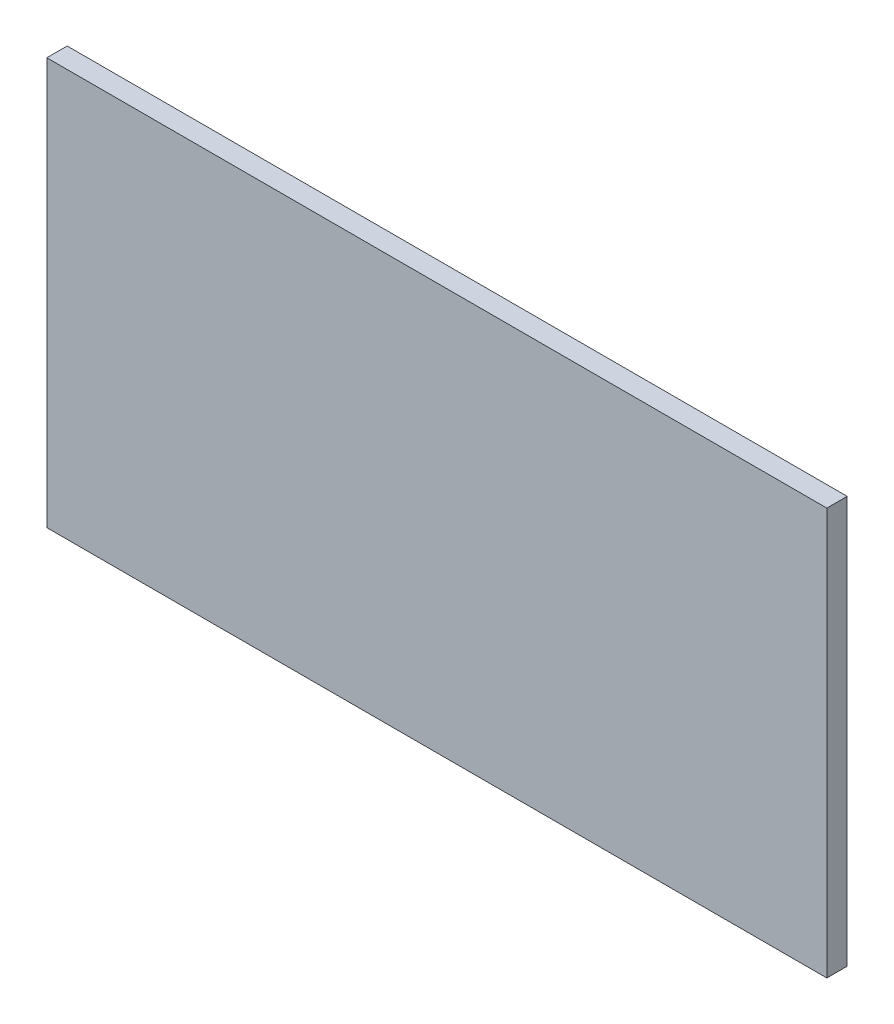
ISO-10303-21;
HEADER;
FILE_DESCRIPTION(('STEP AP214'),'2;1');
FILE_NAME('part.step','',(''),(''),'','','');
FILE_SCHEMA(('AUTOMOTIVE_DESIGN { 1 0 10303 214 1 1 1 1 }'));
ENDSEC;
DATA;
#1=APPLICATION_CONTEXT('core data for automotive mechanical design processes');
#2=APPLICATION_PROTOCOL_DEFINITION('international standard','automotive_design',2000,#1);
#3=PRODUCT_CONTEXT('',#1,'mechanical');
#4=PRODUCT('Part','Part','',(#3));
#5=PRODUCT_RELATED_PRODUCT_CATEGORY('part','',(#4));
#6=PRODUCT_DEFINITION_FORMATION('','',#4);
#7=PRODUCT_DEFINITION_CONTEXT('part definition',#1,'design');
#8=PRODUCT_DEFINITION('design','',#6,#7);
#9=PRODUCT_DEFINITION_SHAPE('','',#8);
#10=(LENGTH_UNIT() NAMED_UNIT(*) SI_UNIT(.MILLI.,.METRE.));
#11=(NAMED_UNIT(*) PLANE_ANGLE_UNIT() SI_UNIT($,.RADIAN.));
#12=(NAMED_UNIT(*) SI_UNIT($,.STERADIAN.) SOLID_ANGLE_UNIT());
#13=UNCERTAINTY_MEASURE_WITH_UNIT(LENGTH_MEASURE(1.E-05),#10,'distance_accuracy_value','');
#14=(GEOMETRIC_REPRESENTATION_CONTEXT(3) GLOBAL_UNCERTAINTY_ASSIGNED_CONTEXT((#13)) GLOBAL_UNIT_ASSIGNED_CONTEXT((#10,
#11,#12)) REPRESENTATION_CONTEXT('',''));
#15=CARTESIAN_POINT('',(0.,0.,0.));
#16=DIRECTION('',(0.,0.,1.));
#17=DIRECTION('',(1.,0.,0.));
#18=AXIS2_PLACEMENT_3D('',#15,#16,#17);
#19=CARTESIAN_POINT('',(0.,0.,6.));
#20=DIRECTION('',(1.,0.,0.));
#21=DIRECTION('',(0.,1.,0.));
#22=AXIS2_PLACEMENT_3D('',#19,#20,#21);
#23=PLANE('',#22);
#24=DIRECTION('',(0.,-1.,0.));
#25=VECTOR('',#24,1.);
#26=CARTESIAN_POINT('',(0.,0.,0.));
#27=LINE('',#26,#25);
#28=CARTESIAN_POINT('',(0.,0.,0.));
#29=VERTEX_POINT('',#28);
#30=CARTESIAN_POINT('',(0.,-120.,0.));
#31=VERTEX_POINT('',#30);
#32=EDGE_CURVE('E113',#29,#31,#27,.T.);
#33=ORIENTED_EDGE('',*,*,#32,.T.);
#34=DIRECTION('',(0.,0.,-1.));
#35=VECTOR('',#34,1.);
#36=CARTESIAN_POINT('',(0.,-120.,6.));
#37=LINE('',#36,#35);
#38=CARTESIAN_POINT('',(0.,-120.,6.));
#39=VERTEX_POINT('',#38);
#40=EDGE_CURVE('E11',#39,#31,#37,.T.);
#41=ORIENTED_EDGE('',*,*,#40,.F.);
#42=DIRECTION('',(0.,-1.,0.));
#43=VECTOR('',#42,1.);
#44=CARTESIAN_POINT('',(0.,0.,6.));
#45=LINE('',#44,#43);
#46=CARTESIAN_POINT('',(0.,0.,6.));
#47=VERTEX_POINT('',#46);
#48=EDGE_CURVE('E97',#47,#39,#45,.T.);
#49=ORIENTED_EDGE('',*,*,#48,.F.);
#50=DIRECTION('',(0.,0.,-1.));
#51=VECTOR('',#50,1.);
#52=CARTESIAN_POINT('',(0.,0.,6.));
#53=LINE('',#52,#51);
#54=EDGE_CURVE('E109',#47,#29,#53,.T.);
#55=ORIENTED_EDGE('',*,*,#54,.T.);
#56=EDGE_LOOP('',(#33,#41,#49,#55));
#57=FACE_BOUND('',#56,.T.);
#58=ADVANCED_FACE('F45',(#57),#23,.F.);
#59=CARTESIAN_POINT('',(0.,-120.,6.));
#60=DIRECTION('',(0.,1.,0.));
#61=DIRECTION('',(0.,0.,1.));
#62=AXIS2_PLACEMENT_3D('',#59,#60,#61);
#63=PLANE('',#62);
#64=DIRECTION('',(1.,0.,0.));
#65=VECTOR('',#64,1.);
#66=CARTESIAN_POINT('',(0.,-120.,0.));
#67=LINE('',#66,#65);
#68=CARTESIAN_POINT('',(230.,-120.,0.));
#69=VERTEX_POINT('',#68);
#70=EDGE_CURVE('E102',#31,#69,#67,.T.);
#71=ORIENTED_EDGE('',*,*,#70,.T.);
#72=DIRECTION('',(0.,0.,-1.));
#73=VECTOR('',#72,1.);
#74=CARTESIAN_POINT('',(230.,-120.,6.));
#75=LINE('',#74,#73);
#76=CARTESIAN_POINT('',(230.,-120.,6.));
#77=VERTEX_POINT('',#76);
#78=EDGE_CURVE('E54',#77,#69,#75,.T.);
#79=ORIENTED_EDGE('',*,*,#78,.F.);
#80=DIRECTION('',(1.,0.,0.));
#81=VECTOR('',#80,1.);
#82=CARTESIAN_POINT('',(0.,-120.,6.));
#83=LINE('',#82,#81);
#84=EDGE_CURVE('E92',#39,#77,#83,.T.);
#85=ORIENTED_EDGE('',*,*,#84,.F.);
#86=ORIENTED_EDGE('',*,*,#40,.T.);
#87=EDGE_LOOP('',(#71,#79,#85,#86));
#88=FACE_BOUND('',#87,.T.);
#89=ADVANCED_FACE('F101',(#88),#63,.F.);
#90=CARTESIAN_POINT('',(230.,0.,6.));
#91=DIRECTION('',(-1.,0.,0.));
#92=DIRECTION('',(0.,-1.,0.));
#93=AXIS2_PLACEMENT_3D('',#90,#91,#92);
#94=PLANE('',#93);
#95=DIRECTION('',(0.,1.,0.));
#96=VECTOR('',#95,1.);
#97=CARTESIAN_POINT('',(230.,0.,0.));
#98=LINE('',#97,#96);
#99=CARTESIAN_POINT('',(230.,0.,0.));
#100=VERTEX_POINT('',#99);
#101=EDGE_CURVE('E79',#69,#100,#98,.T.);
#102=ORIENTED_EDGE('',*,*,#101,.T.);
#103=DIRECTION('',(0.,0.,-1.));
#104=VECTOR('',#103,1.);
#105=CARTESIAN_POINT('',(230.,0.,6.));
#106=LINE('',#105,#104);
#107=CARTESIAN_POINT('',(230.,0.,6.));
#108=VERTEX_POINT('',#107);
#109=EDGE_CURVE('E104',#108,#100,#106,.T.);
#110=ORIENTED_EDGE('',*,*,#109,.F.);
#111=DIRECTION('',(0.,1.,0.));
#112=VECTOR('',#111,1.);
#113=CARTESIAN_POINT('',(230.,0.,6.));
#114=LINE('',#113,#112);
#115=EDGE_CURVE('E95',#77,#108,#114,.T.);
#116=ORIENTED_EDGE('',*,*,#115,.F.);
#117=ORIENTED_EDGE('',*,*,#78,.T.);
#118=EDGE_LOOP('',(#102,#110,#116,#117));
#119=FACE_BOUND('',#118,.T.);
#120=ADVANCED_FACE('F105',(#119),#94,.F.);
#121=CARTESIAN_POINT('',(0.,0.,6.));
#122=DIRECTION('',(0.,-1.,0.));
#123=DIRECTION('',(0.,0.,-1.));
#124=AXIS2_PLACEMENT_3D('',#121,#122,#123);
#125=PLANE('',#124);
#126=DIRECTION('',(-1.,0.,0.));
#127=VECTOR('',#126,1.);
#128=CARTESIAN_POINT('',(0.,0.,0.));
#129=LINE('',#128,#127);
#130=EDGE_CURVE('E85',#100,#29,#129,.T.);
#131=ORIENTED_EDGE('',*,*,#130,.T.);
#132=ORIENTED_EDGE('',*,*,#54,.F.);
#133=DIRECTION('',(-1.,0.,0.));
#134=VECTOR('',#133,1.);
#135=CARTESIAN_POINT('',(0.,0.,6.));
#136=LINE('',#135,#134);
#137=EDGE_CURVE('E62',#108,#47,#136,.T.);
#138=ORIENTED_EDGE('',*,*,#137,.F.);
#139=ORIENTED_EDGE('',*,*,#109,.T.);
#140=EDGE_LOOP('',(#131,#132,#138,#139));
#141=FACE_BOUND('',#140,.T.);
#142=ADVANCED_FACE('F126',(#141),#125,.F.);
#143=CARTESIAN_POINT('',(0.,0.,6.));
#144=DIRECTION('',(0.,0.,1.));
#145=DIRECTION('',(1.,0.,0.));
#146=AXIS2_PLACEMENT_3D('',#143,#144,#145);
#147=PLANE('',#146);
#148=ORIENTED_EDGE('',*,*,#48,.T.);
#149=ORIENTED_EDGE('',*,*,#84,.T.);
#150=ORIENTED_EDGE('',*,*,#115,.T.);
#151=ORIENTED_EDGE('',*,*,#137,.T.);
#152=EDGE_LOOP('',(#148,#149,#150,#151));
#153=FACE_BOUND('',#152,.T.);
#154=ADVANCED_FACE('F93',(#153),#147,.T.);
#155=CARTESIAN_POINT('',(0.,0.,0.));
#156=DIRECTION('',(0.,0.,1.));
#157=DIRECTION('',(1.,0.,0.));
#158=AXIS2_PLACEMENT_3D('',#155,#156,#157);
#159=PLANE('',#158);
#160=ORIENTED_EDGE('',*,*,#32,.F.);
#161=ORIENTED_EDGE('',*,*,#130,.F.);
#162=ORIENTED_EDGE('',*,*,#101,.F.);
#163=ORIENTED_EDGE('',*,*,#70,.F.);
#164=EDGE_LOOP('',(#160,#161,#162,#163));
#165=FACE_BOUND('',#164,.T.);
#166=ADVANCED_FACE('F129',(#165),#159,.F.);
#167=CLOSED_SHELL('',(#58,#89,#120,#142,#154,#166));
#168=MANIFOLD_SOLID_BREP('B2',#167);
#169=ADVANCED_BREP_SHAPE_REPRESENTATION('',(#18,#168),#14);
#170=SHAPE_DEFINITION_REPRESENTATION(#9,#169);
ENDSEC;
END-ISO-10303-21;
